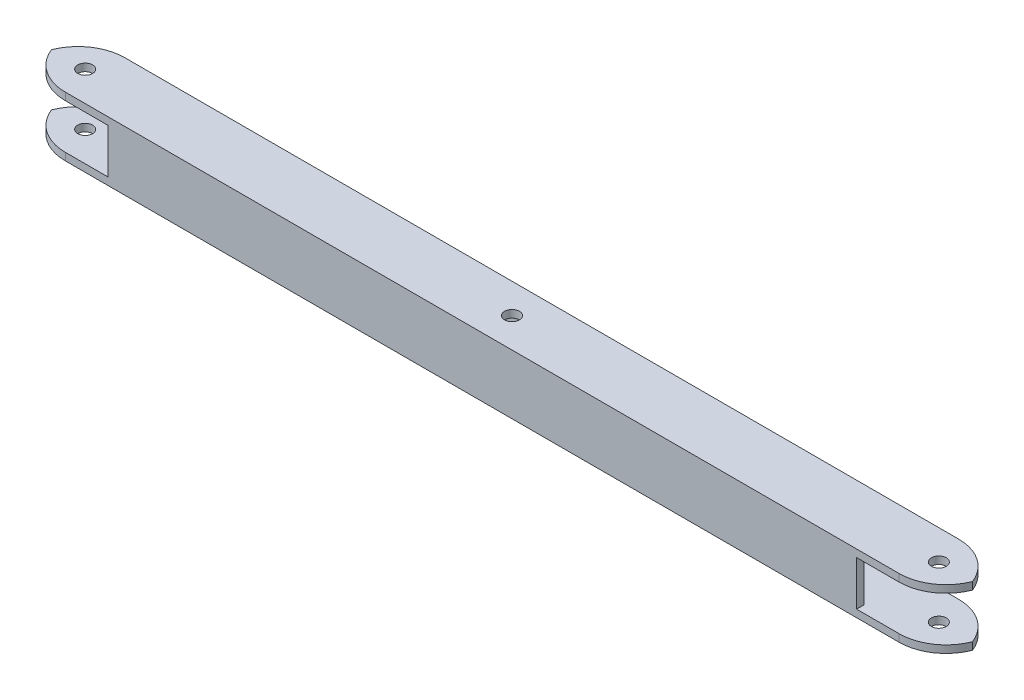
ISO-10303-21;
HEADER;
FILE_DESCRIPTION(('STEP AP214'),'2;1');
FILE_NAME('part.step','',(''),(''),'','','');
FILE_SCHEMA(('AUTOMOTIVE_DESIGN { 1 0 10303 214 1 1 1 1 }'));
ENDSEC;
DATA;
#1=APPLICATION_CONTEXT('core data for automotive mechanical design processes');
#2=APPLICATION_PROTOCOL_DEFINITION('international standard','automotive_design',2000,#1);
#3=PRODUCT_CONTEXT('',#1,'mechanical');
#4=PRODUCT('Part','Part','',(#3));
#5=PRODUCT_RELATED_PRODUCT_CATEGORY('part','',(#4));
#6=PRODUCT_DEFINITION_FORMATION('','',#4);
#7=PRODUCT_DEFINITION_CONTEXT('part definition',#1,'design');
#8=PRODUCT_DEFINITION('design','',#6,#7);
#9=PRODUCT_DEFINITION_SHAPE('','',#8);
#10=(LENGTH_UNIT() NAMED_UNIT(*) SI_UNIT(.MILLI.,.METRE.));
#11=(NAMED_UNIT(*) PLANE_ANGLE_UNIT() SI_UNIT($,.RADIAN.));
#12=(NAMED_UNIT(*) SI_UNIT($,.STERADIAN.) SOLID_ANGLE_UNIT());
#13=UNCERTAINTY_MEASURE_WITH_UNIT(LENGTH_MEASURE(1.E-05),#10,'distance_accuracy_value','');
#14=(GEOMETRIC_REPRESENTATION_CONTEXT(3) GLOBAL_UNCERTAINTY_ASSIGNED_CONTEXT((#13)) GLOBAL_UNIT_ASSIGNED_CONTEXT((#10,
#11,#12)) REPRESENTATION_CONTEXT('',''));
#15=CARTESIAN_POINT('',(0.,0.,0.));
#16=DIRECTION('',(0.,0.,1.));
#17=DIRECTION('',(1.,0.,0.));
#18=AXIS2_PLACEMENT_3D('',#15,#16,#17);
#19=CARTESIAN_POINT('',(395.5,25.4,25.4000000000002));
#20=DIRECTION('',(0.,0.,-1.));
#21=DIRECTION('',(-1.,0.,0.));
#22=AXIS2_PLACEMENT_3D('',#19,#20,#21);
#23=PLANE('',#22);
#24=DIRECTION('',(1.,0.,0.));
#25=VECTOR('',#24,1.);
#26=CARTESIAN_POINT('',(395.5,0.,25.4000000000002));
#27=LINE('',#26,#25);
#28=CARTESIAN_POINT('',(20.,0.,25.4000000000003));
#29=VERTEX_POINT('',#28);
#30=CARTESIAN_POINT('',(375.5,0.,25.4000000000002));
#31=VERTEX_POINT('',#30);
#32=EDGE_CURVE('E284',#29,#31,#27,.T.);
#33=ORIENTED_EDGE('',*,*,#32,.T.);
#34=DIRECTION('',(0.,-1.,0.));
#35=VECTOR('',#34,1.);
#36=CARTESIAN_POINT('',(375.5,25.4,25.4000000000002));
#37=LINE('',#36,#35);
#38=CARTESIAN_POINT('',(375.5,3.175,25.4000000000003));
#39=VERTEX_POINT('',#38);
#40=EDGE_CURVE('E11',#31,#39,#37,.F.);
#41=ORIENTED_EDGE('',*,*,#40,.T.);
#42=DIRECTION('',(1.,0.,0.));
#43=VECTOR('',#42,1.);
#44=CARTESIAN_POINT('',(357.4,3.175,25.4000000000003));
#45=LINE('',#44,#43);
#46=CARTESIAN_POINT('',(357.4,3.175,25.4000000000003));
#47=VERTEX_POINT('',#46);
#48=EDGE_CURVE('E188',#47,#39,#45,.T.);
#49=ORIENTED_EDGE('',*,*,#48,.F.);
#50=DIRECTION('',(0.,1.,0.));
#51=VECTOR('',#50,1.);
#52=CARTESIAN_POINT('',(357.4,22.225,25.4000000000003));
#53=LINE('',#52,#51);
#54=CARTESIAN_POINT('',(357.4,22.225,25.4000000000003));
#55=VERTEX_POINT('',#54);
#56=EDGE_CURVE('E194',#47,#55,#53,.T.);
#57=ORIENTED_EDGE('',*,*,#56,.T.);
#58=DIRECTION('',(1.,0.,0.));
#59=VECTOR('',#58,1.);
#60=CARTESIAN_POINT('',(357.4,22.225,25.4000000000003));
#61=LINE('',#60,#59);
#62=CARTESIAN_POINT('',(375.5,22.225,25.4000000000003));
#63=VERTEX_POINT('',#62);
#64=EDGE_CURVE('E176',#55,#63,#61,.T.);
#65=ORIENTED_EDGE('',*,*,#64,.T.);
#66=DIRECTION('',(0.,-1.,0.));
#67=VECTOR('',#66,1.);
#68=CARTESIAN_POINT('',(375.5,25.4,25.4000000000002));
#69=LINE('',#68,#67);
#70=CARTESIAN_POINT('',(375.5,25.4,25.4000000000002));
#71=VERTEX_POINT('',#70);
#72=EDGE_CURVE('E46',#63,#71,#69,.F.);
#73=ORIENTED_EDGE('',*,*,#72,.T.);
#74=DIRECTION('',(1.,0.,0.));
#75=VECTOR('',#74,1.);
#76=CARTESIAN_POINT('',(395.5,25.4,25.4000000000002));
#77=LINE('',#76,#75);
#78=CARTESIAN_POINT('',(20.,25.4,25.4000000000003));
#79=VERTEX_POINT('',#78);
#80=EDGE_CURVE('E287',#79,#71,#77,.T.);
#81=ORIENTED_EDGE('',*,*,#80,.F.);
#82=DIRECTION('',(0.,-1.,0.));
#83=VECTOR('',#82,1.);
#84=CARTESIAN_POINT('',(20.,25.4,25.4000000000003));
#85=LINE('',#84,#83);
#86=CARTESIAN_POINT('',(20.,22.225,25.4000000000003));
#87=VERTEX_POINT('',#86);
#88=EDGE_CURVE('E344',#79,#87,#85,.T.);
#89=ORIENTED_EDGE('',*,*,#88,.T.);
#90=DIRECTION('',(-1.,0.,0.));
#91=VECTOR('',#90,1.);
#92=CARTESIAN_POINT('',(38.1,22.225,25.4000000000003));
#93=LINE('',#92,#91);
#94=CARTESIAN_POINT('',(38.1,22.225,25.4000000000003));
#95=VERTEX_POINT('',#94);
#96=EDGE_CURVE('E232',#95,#87,#93,.T.);
#97=ORIENTED_EDGE('',*,*,#96,.F.);
#98=DIRECTION('',(0.,1.,0.));
#99=VECTOR('',#98,1.);
#100=CARTESIAN_POINT('',(38.1,22.225,25.4000000000003));
#101=LINE('',#100,#99);
#102=CARTESIAN_POINT('',(38.1,3.175,25.4000000000003));
#103=VERTEX_POINT('',#102);
#104=EDGE_CURVE('E228',#103,#95,#101,.T.);
#105=ORIENTED_EDGE('',*,*,#104,.F.);
#106=DIRECTION('',(-1.,0.,0.));
#107=VECTOR('',#106,1.);
#108=CARTESIAN_POINT('',(38.1,3.175,25.4000000000003));
#109=LINE('',#108,#107);
#110=CARTESIAN_POINT('',(20.,3.175,25.4000000000003));
#111=VERTEX_POINT('',#110);
#112=EDGE_CURVE('E236',#103,#111,#109,.T.);
#113=ORIENTED_EDGE('',*,*,#112,.T.);
#114=DIRECTION('',(0.,-1.,0.));
#115=VECTOR('',#114,1.);
#116=CARTESIAN_POINT('',(20.,25.4,25.4000000000003));
#117=LINE('',#116,#115);
#118=EDGE_CURVE('E347',#111,#29,#117,.T.);
#119=ORIENTED_EDGE('',*,*,#118,.T.);
#120=EDGE_LOOP('',(#33,#41,#49,#57,#65,#73,#81,#89,#97,#105,#113,#119));
#121=FACE_BOUND('',#120,.T.);
#122=ADVANCED_FACE('F37',(#121),#23,.F.);
#123=CARTESIAN_POINT('',(0.,25.4,0.));
#124=DIRECTION('',(0.,0.,1.));
#125=DIRECTION('',(1.,0.,0.));
#126=AXIS2_PLACEMENT_3D('',#123,#124,#125);
#127=PLANE('',#126);
#128=DIRECTION('',(1.,0.,0.));
#129=VECTOR('',#128,1.);
#130=CARTESIAN_POINT('',(357.4,3.175,0.));
#131=LINE('',#130,#129);
#132=CARTESIAN_POINT('',(357.4,3.175,0.));
#133=VERTEX_POINT('',#132);
#134=CARTESIAN_POINT('',(375.5,3.175,0.));
#135=VERTEX_POINT('',#134);
#136=EDGE_CURVE('E212',#133,#135,#131,.T.);
#137=ORIENTED_EDGE('',*,*,#136,.T.);
#138=DIRECTION('',(0.,-1.,0.));
#139=VECTOR('',#138,1.);
#140=CARTESIAN_POINT('',(375.5,25.4,0.));
#141=LINE('',#140,#139);
#142=CARTESIAN_POINT('',(375.5,0.,0.));
#143=VERTEX_POINT('',#142);
#144=EDGE_CURVE('E312',#135,#143,#141,.T.);
#145=ORIENTED_EDGE('',*,*,#144,.T.);
#146=DIRECTION('',(-1.,0.,0.));
#147=VECTOR('',#146,1.);
#148=CARTESIAN_POINT('',(0.,0.,0.));
#149=LINE('',#148,#147);
#150=CARTESIAN_POINT('',(20.,0.,0.));
#151=VERTEX_POINT('',#150);
#152=EDGE_CURVE('E290',#143,#151,#149,.T.);
#153=ORIENTED_EDGE('',*,*,#152,.T.);
#154=DIRECTION('',(0.,-1.,0.));
#155=VECTOR('',#154,1.);
#156=CARTESIAN_POINT('',(20.,25.4,0.));
#157=LINE('',#156,#155);
#158=CARTESIAN_POINT('',(20.,3.175,0.));
#159=VERTEX_POINT('',#158);
#160=EDGE_CURVE('E307',#151,#159,#157,.F.);
#161=ORIENTED_EDGE('',*,*,#160,.T.);
#162=DIRECTION('',(-1.,0.,0.));
#163=VECTOR('',#162,1.);
#164=CARTESIAN_POINT('',(38.1,3.175,0.));
#165=LINE('',#164,#163);
#166=CARTESIAN_POINT('',(38.1,3.175,0.));
#167=VERTEX_POINT('',#166);
#168=EDGE_CURVE('E239',#167,#159,#165,.T.);
#169=ORIENTED_EDGE('',*,*,#168,.F.);
#170=DIRECTION('',(0.,-1.,0.));
#171=VECTOR('',#170,1.);
#172=CARTESIAN_POINT('',(38.1,3.175,0.));
#173=LINE('',#172,#171);
#174=CARTESIAN_POINT('',(38.1,22.225,0.));
#175=VERTEX_POINT('',#174);
#176=EDGE_CURVE('E221',#175,#167,#173,.T.);
#177=ORIENTED_EDGE('',*,*,#176,.F.);
#178=DIRECTION('',(-1.,0.,0.));
#179=VECTOR('',#178,1.);
#180=CARTESIAN_POINT('',(38.1,22.225,0.));
#181=LINE('',#180,#179);
#182=CARTESIAN_POINT('',(20.,22.225,0.));
#183=VERTEX_POINT('',#182);
#184=EDGE_CURVE('E231',#175,#183,#181,.T.);
#185=ORIENTED_EDGE('',*,*,#184,.T.);
#186=DIRECTION('',(0.,-1.,0.));
#187=VECTOR('',#186,1.);
#188=CARTESIAN_POINT('',(20.,25.4,0.));
#189=LINE('',#188,#187);
#190=CARTESIAN_POINT('',(20.,25.4,0.));
#191=VERTEX_POINT('',#190);
#192=EDGE_CURVE('E305',#183,#191,#189,.F.);
#193=ORIENTED_EDGE('',*,*,#192,.T.);
#194=DIRECTION('',(-1.,0.,0.));
#195=VECTOR('',#194,1.);
#196=CARTESIAN_POINT('',(0.,25.4,0.));
#197=LINE('',#196,#195);
#198=CARTESIAN_POINT('',(375.5,25.4,0.));
#199=VERTEX_POINT('',#198);
#200=EDGE_CURVE('E289',#199,#191,#197,.T.);
#201=ORIENTED_EDGE('',*,*,#200,.F.);
#202=DIRECTION('',(0.,-1.,0.));
#203=VECTOR('',#202,1.);
#204=CARTESIAN_POINT('',(375.5,25.4,0.));
#205=LINE('',#204,#203);
#206=CARTESIAN_POINT('',(375.5,22.225,0.));
#207=VERTEX_POINT('',#206);
#208=EDGE_CURVE('E309',#199,#207,#205,.T.);
#209=ORIENTED_EDGE('',*,*,#208,.T.);
#210=DIRECTION('',(1.,0.,0.));
#211=VECTOR('',#210,1.);
#212=CARTESIAN_POINT('',(357.4,22.225,0.));
#213=LINE('',#212,#211);
#214=CARTESIAN_POINT('',(357.4,22.225,0.));
#215=VERTEX_POINT('',#214);
#216=EDGE_CURVE('E210',#215,#207,#213,.T.);
#217=ORIENTED_EDGE('',*,*,#216,.F.);
#218=DIRECTION('',(0.,-1.,0.));
#219=VECTOR('',#218,1.);
#220=CARTESIAN_POINT('',(357.4,3.175,0.));
#221=LINE('',#220,#219);
#222=EDGE_CURVE('E189',#215,#133,#221,.T.);
#223=ORIENTED_EDGE('',*,*,#222,.T.);
#224=EDGE_LOOP('',(#137,#145,#153,#161,#169,#177,#185,#193,#201,#209,#217,#223));
#225=FACE_BOUND('',#224,.T.);
#226=ADVANCED_FACE('F373',(#225),#127,.F.);
#227=CARTESIAN_POINT('',(197.75,25.4,12.7));
#228=DIRECTION('',(0.,-1.,0.));
#229=DIRECTION('',(0.,0.,-1.));
#230=AXIS2_PLACEMENT_3D('',#227,#228,#229);
#231=CYLINDRICAL_SURFACE('',#230,3.175);
#232=CARTESIAN_POINT('',(197.75,22.225,12.7));
#233=DIRECTION('',(0.,1.,0.));
#234=DIRECTION('',(0.,0.,1.));
#235=AXIS2_PLACEMENT_3D('',#232,#233,#234);
#236=CIRCLE('',#235,3.175);
#237=CARTESIAN_POINT('',(197.75,22.225,15.875));
#238=VERTEX_POINT('',#237);
#239=EDGE_CURVE('E265',#238,#238,#236,.T.);
#240=ORIENTED_EDGE('',*,*,#239,.F.);
#241=EDGE_LOOP('',(#240));
#242=FACE_BOUND('',#241,.T.);
#243=CARTESIAN_POINT('',(197.75,25.4,12.7));
#244=DIRECTION('',(0.,1.,0.));
#245=DIRECTION('',(0.,0.,1.));
#246=AXIS2_PLACEMENT_3D('',#243,#244,#245);
#247=CIRCLE('',#246,3.175);
#248=CARTESIAN_POINT('',(197.75,25.4,15.875));
#249=VERTEX_POINT('',#248);
#250=EDGE_CURVE('E281',#249,#249,#247,.T.);
#251=ORIENTED_EDGE('',*,*,#250,.T.);
#252=EDGE_LOOP('',(#251));
#253=FACE_BOUND('',#252,.T.);
#254=ADVANCED_FACE('F442',(#242,#253),#231,.F.);
#255=CARTESIAN_POINT('',(379.74,25.4,12.7));
#256=DIRECTION('',(0.,-1.,0.));
#257=DIRECTION('',(0.,0.,-1.));
#258=AXIS2_PLACEMENT_3D('',#255,#256,#257);
#259=CYLINDRICAL_SURFACE('',#258,3.17500000000009);
#260=CARTESIAN_POINT('',(379.74,22.225,12.7));
#261=DIRECTION('',(0.,1.,0.));
#262=DIRECTION('',(0.,0.,1.));
#263=AXIS2_PLACEMENT_3D('',#260,#261,#262);
#264=CIRCLE('',#263,3.17500000000009);
#265=CARTESIAN_POINT('',(379.74,22.225,15.8750000000001));
#266=VERTEX_POINT('',#265);
#267=EDGE_CURVE('E262',#266,#266,#264,.T.);
#268=ORIENTED_EDGE('',*,*,#267,.F.);
#269=EDGE_LOOP('',(#268));
#270=FACE_BOUND('',#269,.T.);
#271=CARTESIAN_POINT('',(379.74,25.4,12.7));
#272=DIRECTION('',(0.,1.,0.));
#273=DIRECTION('',(0.,0.,-1.));
#274=AXIS2_PLACEMENT_3D('',#271,#272,#273);
#275=CIRCLE('',#274,3.17500000000009);
#276=CARTESIAN_POINT('',(379.74,25.4,9.52499999999993));
#277=VERTEX_POINT('',#276);
#278=EDGE_CURVE('E275',#277,#277,#275,.T.);
#279=ORIENTED_EDGE('',*,*,#278,.T.);
#280=EDGE_LOOP('',(#279));
#281=FACE_BOUND('',#280,.T.);
#282=ADVANCED_FACE('F478',(#270,#281),#259,.F.);
#283=CARTESIAN_POINT('',(15.76,25.4,12.7000000000001));
#284=DIRECTION('',(0.,-1.,0.));
#285=DIRECTION('',(0.,0.,-1.));
#286=AXIS2_PLACEMENT_3D('',#283,#284,#285);
#287=CYLINDRICAL_SURFACE('',#286,3.17500000000001);
#288=CARTESIAN_POINT('',(15.76,22.225,12.7000000000001));
#289=DIRECTION('',(0.,1.,0.));
#290=DIRECTION('',(0.,0.,1.));
#291=AXIS2_PLACEMENT_3D('',#288,#289,#290);
#292=CIRCLE('',#291,3.17500000000001);
#293=CARTESIAN_POINT('',(15.76,22.225,15.8750000000001));
#294=VERTEX_POINT('',#293);
#295=EDGE_CURVE('E261',#294,#294,#292,.T.);
#296=ORIENTED_EDGE('',*,*,#295,.F.);
#297=EDGE_LOOP('',(#296));
#298=FACE_BOUND('',#297,.T.);
#299=CARTESIAN_POINT('',(15.76,25.4,12.7000000000001));
#300=DIRECTION('',(0.,1.,0.));
#301=DIRECTION('',(0.,0.,1.));
#302=AXIS2_PLACEMENT_3D('',#299,#300,#301);
#303=CIRCLE('',#302,3.17500000000001);
#304=CARTESIAN_POINT('',(15.76,25.4,15.8750000000001));
#305=VERTEX_POINT('',#304);
#306=EDGE_CURVE('E269',#305,#305,#303,.T.);
#307=ORIENTED_EDGE('',*,*,#306,.T.);
#308=EDGE_LOOP('',(#307));
#309=FACE_BOUND('',#308,.T.);
#310=ADVANCED_FACE('F473',(#298,#309),#287,.F.);
#311=CARTESIAN_POINT('',(0.,25.4,0.));
#312=DIRECTION('',(0.,-1.,0.));
#313=DIRECTION('',(0.,0.,-1.));
#314=AXIS2_PLACEMENT_3D('',#311,#312,#313);
#315=PLANE('',#314);
#316=CARTESIAN_POINT('',(375.5,25.4,5.40000000000018));
#317=DIRECTION('',(0.,-1.,0.));
#318=DIRECTION('',(0.,0.,-1.));
#319=AXIS2_PLACEMENT_3D('',#316,#317,#318);
#320=CIRCLE('',#319,20.);
#321=CARTESIAN_POINT('',(394.120150375333,25.4,12.7000000000001));
#322=VERTEX_POINT('',#321);
#323=EDGE_CURVE('E54',#71,#322,#320,.F.);
#324=ORIENTED_EDGE('',*,*,#323,.T.);
#325=CARTESIAN_POINT('',(375.5,25.4,20.));
#326=DIRECTION('',(0.,-1.,0.));
#327=DIRECTION('',(0.,0.,-1.));
#328=AXIS2_PLACEMENT_3D('',#325,#326,#327);
#329=CIRCLE('',#328,20.);
#330=EDGE_CURVE('E342',#322,#199,#329,.F.);
#331=ORIENTED_EDGE('',*,*,#330,.T.);
#332=ORIENTED_EDGE('',*,*,#200,.T.);
#333=CARTESIAN_POINT('',(20.,25.4,20.));
#334=DIRECTION('',(0.,-1.,0.));
#335=DIRECTION('',(0.,0.,-1.));
#336=AXIS2_PLACEMENT_3D('',#333,#334,#335);
#337=CIRCLE('',#336,20.);
#338=CARTESIAN_POINT('',(1.37984962466732,25.4,12.7000000000001));
#339=VERTEX_POINT('',#338);
#340=EDGE_CURVE('E61',#191,#339,#337,.F.);
#341=ORIENTED_EDGE('',*,*,#340,.T.);
#342=CARTESIAN_POINT('',(20.,25.4,5.40000000000028));
#343=DIRECTION('',(0.,-1.,0.));
#344=DIRECTION('',(0.,0.,-1.));
#345=AXIS2_PLACEMENT_3D('',#342,#343,#344);
#346=CIRCLE('',#345,20.);
#347=EDGE_CURVE('E339',#339,#79,#346,.F.);
#348=ORIENTED_EDGE('',*,*,#347,.T.);
#349=ORIENTED_EDGE('',*,*,#80,.T.);
#350=EDGE_LOOP('',(#324,#331,#332,#341,#348,#349));
#351=FACE_BOUND('',#350,.T.);
#352=ORIENTED_EDGE('',*,*,#250,.F.);
#353=EDGE_LOOP('',(#352));
#354=FACE_BOUND('',#353,.T.);
#355=ORIENTED_EDGE('',*,*,#278,.F.);
#356=EDGE_LOOP('',(#355));
#357=FACE_BOUND('',#356,.T.);
#358=ORIENTED_EDGE('',*,*,#306,.F.);
#359=EDGE_LOOP('',(#358));
#360=FACE_BOUND('',#359,.T.);
#361=ADVANCED_FACE('F417',(#351,#354,#357,#360),#315,.F.);
#362=CARTESIAN_POINT('',(0.,0.,0.));
#363=DIRECTION('',(0.,-1.,0.));
#364=DIRECTION('',(0.,0.,-1.));
#365=AXIS2_PLACEMENT_3D('',#362,#363,#364);
#366=PLANE('',#365);
#367=CARTESIAN_POINT('',(379.74,0.,12.7));
#368=DIRECTION('',(0.,1.,0.));
#369=DIRECTION('',(0.,0.,-1.));
#370=AXIS2_PLACEMENT_3D('',#367,#368,#369);
#371=CIRCLE('',#370,3.17500000000009);
#372=CARTESIAN_POINT('',(379.74,0.,9.52499999999993));
#373=VERTEX_POINT('',#372);
#374=EDGE_CURVE('E272',#373,#373,#371,.T.);
#375=ORIENTED_EDGE('',*,*,#374,.T.);
#376=EDGE_LOOP('',(#375));
#377=FACE_BOUND('',#376,.T.);
#378=ORIENTED_EDGE('',*,*,#152,.F.);
#379=CARTESIAN_POINT('',(375.5,0.,20.));
#380=DIRECTION('',(0.,-1.,0.));
#381=DIRECTION('',(0.,0.,-1.));
#382=AXIS2_PLACEMENT_3D('',#379,#380,#381);
#383=CIRCLE('',#382,20.);
#384=CARTESIAN_POINT('',(394.120150375333,0.,12.7000000000001));
#385=VERTEX_POINT('',#384);
#386=EDGE_CURVE('E321',#143,#385,#383,.T.);
#387=ORIENTED_EDGE('',*,*,#386,.T.);
#388=CARTESIAN_POINT('',(375.5,0.,5.40000000000018));
#389=DIRECTION('',(0.,-1.,0.));
#390=DIRECTION('',(0.,0.,-1.));
#391=AXIS2_PLACEMENT_3D('',#388,#389,#390);
#392=CIRCLE('',#391,20.);
#393=EDGE_CURVE('E319',#385,#31,#392,.T.);
#394=ORIENTED_EDGE('',*,*,#393,.T.);
#395=ORIENTED_EDGE('',*,*,#32,.F.);
#396=CARTESIAN_POINT('',(20.,0.,5.40000000000028));
#397=DIRECTION('',(0.,-1.,0.));
#398=DIRECTION('',(0.,0.,-1.));
#399=AXIS2_PLACEMENT_3D('',#396,#397,#398);
#400=CIRCLE('',#399,20.);
#401=CARTESIAN_POINT('',(1.37984962466732,0.,12.7000000000001));
#402=VERTEX_POINT('',#401);
#403=EDGE_CURVE('E317',#29,#402,#400,.T.);
#404=ORIENTED_EDGE('',*,*,#403,.T.);
#405=CARTESIAN_POINT('',(20.,0.,20.));
#406=DIRECTION('',(0.,-1.,0.));
#407=DIRECTION('',(0.,0.,-1.));
#408=AXIS2_PLACEMENT_3D('',#405,#406,#407);
#409=CIRCLE('',#408,20.);
#410=EDGE_CURVE('E315',#402,#151,#409,.T.);
#411=ORIENTED_EDGE('',*,*,#410,.T.);
#412=EDGE_LOOP('',(#378,#387,#394,#395,#404,#411));
#413=FACE_BOUND('',#412,.T.);
#414=CARTESIAN_POINT('',(197.75,0.,12.7));
#415=DIRECTION('',(0.,1.,0.));
#416=DIRECTION('',(0.,0.,1.));
#417=AXIS2_PLACEMENT_3D('',#414,#415,#416);
#418=CIRCLE('',#417,3.175);
#419=CARTESIAN_POINT('',(197.75,0.,15.875));
#420=VERTEX_POINT('',#419);
#421=EDGE_CURVE('E278',#420,#420,#418,.T.);
#422=ORIENTED_EDGE('',*,*,#421,.T.);
#423=EDGE_LOOP('',(#422));
#424=FACE_BOUND('',#423,.T.);
#425=CARTESIAN_POINT('',(15.76,0.,12.7000000000001));
#426=DIRECTION('',(0.,1.,0.));
#427=DIRECTION('',(0.,0.,1.));
#428=AXIS2_PLACEMENT_3D('',#425,#426,#427);
#429=CIRCLE('',#428,3.17500000000001);
#430=CARTESIAN_POINT('',(15.76,0.,15.8750000000001));
#431=VERTEX_POINT('',#430);
#432=EDGE_CURVE('E268',#431,#431,#429,.T.);
#433=ORIENTED_EDGE('',*,*,#432,.T.);
#434=EDGE_LOOP('',(#433));
#435=FACE_BOUND('',#434,.T.);
#436=ADVANCED_FACE('F399',(#377,#413,#424,#435),#366,.T.);
#437=CARTESIAN_POINT('',(197.75,3.175,12.7));
#438=DIRECTION('',(0.,-1.,0.));
#439=DIRECTION('',(0.,0.,-1.));
#440=AXIS2_PLACEMENT_3D('',#437,#438,#439);
#441=CIRCLE('',#440,3.175);
#442=CARTESIAN_POINT('',(197.75,3.175,9.52500000000001));
#443=VERTEX_POINT('',#442);
#444=EDGE_CURVE('E258',#443,#443,#441,.T.);
#445=ORIENTED_EDGE('',*,*,#444,.F.);
#446=EDGE_LOOP('',(#445));
#447=FACE_BOUND('',#446,.T.);
#448=ORIENTED_EDGE('',*,*,#421,.F.);
#449=EDGE_LOOP('',(#448));
#450=FACE_BOUND('',#449,.T.);
#451=ADVANCED_FACE('F476',(#447,#450),#231,.F.);
#452=CARTESIAN_POINT('',(379.74,3.175,12.7));
#453=DIRECTION('',(0.,-1.,0.));
#454=DIRECTION('',(0.,0.,-1.));
#455=AXIS2_PLACEMENT_3D('',#452,#453,#454);
#456=CIRCLE('',#455,3.17500000000009);
#457=CARTESIAN_POINT('',(379.74,3.175,9.52499999999993));
#458=VERTEX_POINT('',#457);
#459=EDGE_CURVE('E255',#458,#458,#456,.T.);
#460=ORIENTED_EDGE('',*,*,#459,.F.);
#461=EDGE_LOOP('',(#460));
#462=FACE_BOUND('',#461,.T.);
#463=ORIENTED_EDGE('',*,*,#374,.F.);
#464=EDGE_LOOP('',(#463));
#465=FACE_BOUND('',#464,.T.);
#466=ADVANCED_FACE('F471',(#462,#465),#259,.F.);
#467=CARTESIAN_POINT('',(15.76,3.175,12.7000000000001));
#468=DIRECTION('',(0.,-1.,0.));
#469=DIRECTION('',(0.,0.,-1.));
#470=AXIS2_PLACEMENT_3D('',#467,#468,#469);
#471=CIRCLE('',#470,3.17500000000001);
#472=CARTESIAN_POINT('',(15.76,3.175,9.52500000000005));
#473=VERTEX_POINT('',#472);
#474=EDGE_CURVE('E249',#473,#473,#471,.T.);
#475=ORIENTED_EDGE('',*,*,#474,.F.);
#476=EDGE_LOOP('',(#475));
#477=FACE_BOUND('',#476,.T.);
#478=ORIENTED_EDGE('',*,*,#432,.F.);
#479=EDGE_LOOP('',(#478));
#480=FACE_BOUND('',#479,.T.);
#481=ADVANCED_FACE('F467',(#477,#480),#287,.F.);
#482=CARTESIAN_POINT('',(422.440768363208,22.225,22.2250000000003));
#483=DIRECTION('',(0.,1.,0.));
#484=DIRECTION('',(0.,0.,1.));
#485=AXIS2_PLACEMENT_3D('',#482,#483,#484);
#486=PLANE('',#485);
#487=ORIENTED_EDGE('',*,*,#239,.T.);
#488=EDGE_LOOP('',(#487));
#489=FACE_BOUND('',#488,.T.);
#490=ORIENTED_EDGE('',*,*,#216,.T.);
#491=CARTESIAN_POINT('',(375.5,22.225,20.));
#492=DIRECTION('',(0.,1.,0.));
#493=DIRECTION('',(0.,0.,1.));
#494=AXIS2_PLACEMENT_3D('',#491,#492,#493);
#495=CIRCLE('',#494,20.);
#496=CARTESIAN_POINT('',(394.120150375333,22.225,12.7000000000001));
#497=VERTEX_POINT('',#496);
#498=EDGE_CURVE('E336',#207,#497,#495,.F.);
#499=ORIENTED_EDGE('',*,*,#498,.T.);
#500=CARTESIAN_POINT('',(375.5,22.225,5.40000000000018));
#501=DIRECTION('',(0.,1.,0.));
#502=DIRECTION('',(0.,0.,1.));
#503=AXIS2_PLACEMENT_3D('',#500,#501,#502);
#504=CIRCLE('',#503,20.);
#505=EDGE_CURVE('E184',#497,#63,#504,.F.);
#506=ORIENTED_EDGE('',*,*,#505,.T.);
#507=ORIENTED_EDGE('',*,*,#64,.F.);
#508=DIRECTION('',(0.,0.,-1.));
#509=VECTOR('',#508,1.);
#510=CARTESIAN_POINT('',(357.4,22.225,0.));
#511=LINE('',#510,#509);
#512=CARTESIAN_POINT('',(357.4,22.225,22.2250000000003));
#513=VERTEX_POINT('',#512);
#514=EDGE_CURVE('E181',#55,#513,#511,.T.);
#515=ORIENTED_EDGE('',*,*,#514,.T.);
#516=DIRECTION('',(-1.,0.,0.));
#517=VECTOR('',#516,1.);
#518=CARTESIAN_POINT('',(422.440768363208,22.225,22.2250000000003));
#519=LINE('',#518,#517);
#520=CARTESIAN_POINT('',(38.1,22.225,22.2250000000003));
#521=VERTEX_POINT('',#520);
#522=EDGE_CURVE('E247',#513,#521,#519,.T.);
#523=ORIENTED_EDGE('',*,*,#522,.T.);
#524=DIRECTION('',(0.,0.,-1.));
#525=VECTOR('',#524,1.);
#526=CARTESIAN_POINT('',(38.1,22.225,0.));
#527=LINE('',#526,#525);
#528=EDGE_CURVE('E218',#95,#521,#527,.T.);
#529=ORIENTED_EDGE('',*,*,#528,.F.);
#530=ORIENTED_EDGE('',*,*,#96,.T.);
#531=CARTESIAN_POINT('',(20.,22.225,5.40000000000028));
#532=DIRECTION('',(0.,1.,0.));
#533=DIRECTION('',(0.,0.,1.));
#534=AXIS2_PLACEMENT_3D('',#531,#532,#533);
#535=CIRCLE('',#534,20.);
#536=CARTESIAN_POINT('',(1.37984962466732,22.225,12.7000000000001));
#537=VERTEX_POINT('',#536);
#538=EDGE_CURVE('E333',#87,#537,#535,.F.);
#539=ORIENTED_EDGE('',*,*,#538,.T.);
#540=CARTESIAN_POINT('',(20.,22.225,20.));
#541=DIRECTION('',(0.,1.,0.));
#542=DIRECTION('',(0.,0.,1.));
#543=AXIS2_PLACEMENT_3D('',#540,#541,#542);
#544=CIRCLE('',#543,20.);
#545=EDGE_CURVE('E331',#537,#183,#544,.F.);
#546=ORIENTED_EDGE('',*,*,#545,.T.);
#547=ORIENTED_EDGE('',*,*,#184,.F.);
#548=CARTESIAN_POINT('',(38.1,22.225,3.175));
#549=VERTEX_POINT('',#548);
#550=EDGE_CURVE('E217',#549,#175,#527,.T.);
#551=ORIENTED_EDGE('',*,*,#550,.F.);
#552=DIRECTION('',(-1.,0.,0.));
#553=VECTOR('',#552,1.);
#554=CARTESIAN_POINT('',(422.440768363208,22.225,3.175));
#555=LINE('',#554,#553);
#556=CARTESIAN_POINT('',(357.4,22.225,3.175));
#557=VERTEX_POINT('',#556);
#558=EDGE_CURVE('E246',#557,#549,#555,.T.);
#559=ORIENTED_EDGE('',*,*,#558,.F.);
#560=EDGE_CURVE('E198',#557,#215,#511,.T.);
#561=ORIENTED_EDGE('',*,*,#560,.T.);
#562=EDGE_LOOP('',(#490,#499,#506,#507,#515,#523,#529,#530,#539,#546,#547,#551,#559,#561));
#563=FACE_BOUND('',#562,.T.);
#564=ORIENTED_EDGE('',*,*,#295,.T.);
#565=EDGE_LOOP('',(#564));
#566=FACE_BOUND('',#565,.T.);
#567=ORIENTED_EDGE('',*,*,#267,.T.);
#568=EDGE_LOOP('',(#567));
#569=FACE_BOUND('',#568,.T.);
#570=ADVANCED_FACE('F179',(#489,#563,#566,#569),#486,.F.);
#571=CARTESIAN_POINT('',(422.440768363208,3.175,22.2250000000003));
#572=DIRECTION('',(0.,0.,1.));
#573=DIRECTION('',(1.,0.,0.));
#574=AXIS2_PLACEMENT_3D('',#571,#572,#573);
#575=PLANE('',#574);
#576=ORIENTED_EDGE('',*,*,#522,.F.);
#577=DIRECTION('',(0.,-1.,0.));
#578=VECTOR('',#577,1.);
#579=CARTESIAN_POINT('',(357.4,3.175,22.2250000000003));
#580=LINE('',#579,#578);
#581=CARTESIAN_POINT('',(357.4,3.175,22.2250000000003));
#582=VERTEX_POINT('',#581);
#583=EDGE_CURVE('E197',#513,#582,#580,.T.);
#584=ORIENTED_EDGE('',*,*,#583,.T.);
#585=DIRECTION('',(-1.,0.,0.));
#586=VECTOR('',#585,1.);
#587=CARTESIAN_POINT('',(422.440768363208,3.175,22.2250000000003));
#588=LINE('',#587,#586);
#589=CARTESIAN_POINT('',(38.1,3.175,22.2250000000003));
#590=VERTEX_POINT('',#589);
#591=EDGE_CURVE('E250',#582,#590,#588,.T.);
#592=ORIENTED_EDGE('',*,*,#591,.T.);
#593=DIRECTION('',(0.,1.,0.));
#594=VECTOR('',#593,1.);
#595=CARTESIAN_POINT('',(38.1,3.175,22.2250000000003));
#596=LINE('',#595,#594);
#597=EDGE_CURVE('E235',#590,#521,#596,.T.);
#598=ORIENTED_EDGE('',*,*,#597,.T.);
#599=EDGE_LOOP('',(#576,#584,#592,#598));
#600=FACE_BOUND('',#599,.T.);
#601=ADVANCED_FACE('F409',(#600),#575,.F.);
#602=CARTESIAN_POINT('',(422.440768363208,3.175,3.175));
#603=DIRECTION('',(0.,-1.,0.));
#604=DIRECTION('',(0.,0.,-1.));
#605=AXIS2_PLACEMENT_3D('',#602,#603,#604);
#606=PLANE('',#605);
#607=ORIENTED_EDGE('',*,*,#444,.T.);
#608=EDGE_LOOP('',(#607));
#609=FACE_BOUND('',#608,.T.);
#610=CARTESIAN_POINT('',(375.5,3.175,5.40000000000018));
#611=DIRECTION('',(0.,-1.,0.));
#612=DIRECTION('',(0.,0.,-1.));
#613=AXIS2_PLACEMENT_3D('',#610,#611,#612);
#614=CIRCLE('',#613,20.);
#615=CARTESIAN_POINT('',(394.120150375333,3.175,12.7000000000001));
#616=VERTEX_POINT('',#615);
#617=EDGE_CURVE('E327',#39,#616,#614,.F.);
#618=ORIENTED_EDGE('',*,*,#617,.T.);
#619=CARTESIAN_POINT('',(375.5,3.175,20.));
#620=DIRECTION('',(0.,-1.,0.));
#621=DIRECTION('',(0.,0.,-1.));
#622=AXIS2_PLACEMENT_3D('',#619,#620,#621);
#623=CIRCLE('',#622,20.);
#624=EDGE_CURVE('E329',#616,#135,#623,.F.);
#625=ORIENTED_EDGE('',*,*,#624,.T.);
#626=ORIENTED_EDGE('',*,*,#136,.F.);
#627=DIRECTION('',(0.,0.,1.));
#628=VECTOR('',#627,1.);
#629=CARTESIAN_POINT('',(357.4,3.175,25.4000000000003));
#630=LINE('',#629,#628);
#631=CARTESIAN_POINT('',(357.4,3.175,3.175));
#632=VERTEX_POINT('',#631);
#633=EDGE_CURVE('E204',#133,#632,#630,.T.);
#634=ORIENTED_EDGE('',*,*,#633,.T.);
#635=DIRECTION('',(-1.,0.,0.));
#636=VECTOR('',#635,1.);
#637=CARTESIAN_POINT('',(422.440768363208,3.175,3.175));
#638=LINE('',#637,#636);
#639=CARTESIAN_POINT('',(38.1,3.175,3.175));
#640=VERTEX_POINT('',#639);
#641=EDGE_CURVE('E252',#632,#640,#638,.T.);
#642=ORIENTED_EDGE('',*,*,#641,.T.);
#643=DIRECTION('',(0.,0.,1.));
#644=VECTOR('',#643,1.);
#645=CARTESIAN_POINT('',(38.1,3.175,25.4000000000003));
#646=LINE('',#645,#644);
#647=EDGE_CURVE('E225',#167,#640,#646,.T.);
#648=ORIENTED_EDGE('',*,*,#647,.F.);
#649=ORIENTED_EDGE('',*,*,#168,.T.);
#650=CARTESIAN_POINT('',(20.,3.175,20.));
#651=DIRECTION('',(0.,-1.,0.));
#652=DIRECTION('',(0.,0.,-1.));
#653=AXIS2_PLACEMENT_3D('',#650,#651,#652);
#654=CIRCLE('',#653,20.);
#655=CARTESIAN_POINT('',(1.37984962466732,3.175,12.7000000000001));
#656=VERTEX_POINT('',#655);
#657=EDGE_CURVE('E323',#159,#656,#654,.F.);
#658=ORIENTED_EDGE('',*,*,#657,.T.);
#659=CARTESIAN_POINT('',(20.,3.175,5.40000000000028));
#660=DIRECTION('',(0.,-1.,0.));
#661=DIRECTION('',(0.,0.,-1.));
#662=AXIS2_PLACEMENT_3D('',#659,#660,#661);
#663=CIRCLE('',#662,20.);
#664=EDGE_CURVE('E325',#656,#111,#663,.F.);
#665=ORIENTED_EDGE('',*,*,#664,.T.);
#666=ORIENTED_EDGE('',*,*,#112,.F.);
#667=EDGE_CURVE('E224',#590,#103,#646,.T.);
#668=ORIENTED_EDGE('',*,*,#667,.F.);
#669=ORIENTED_EDGE('',*,*,#591,.F.);
#670=EDGE_CURVE('E202',#582,#47,#630,.T.);
#671=ORIENTED_EDGE('',*,*,#670,.T.);
#672=ORIENTED_EDGE('',*,*,#48,.T.);
#673=EDGE_LOOP('',(#618,#625,#626,#634,#642,#648,#649,#658,#665,#666,#668,#669,#671,#672));
#674=FACE_BOUND('',#673,.T.);
#675=ORIENTED_EDGE('',*,*,#474,.T.);
#676=EDGE_LOOP('',(#675));
#677=FACE_BOUND('',#676,.T.);
#678=ORIENTED_EDGE('',*,*,#459,.T.);
#679=EDGE_LOOP('',(#678));
#680=FACE_BOUND('',#679,.T.);
#681=ADVANCED_FACE('F388',(#609,#674,#677,#680),#606,.F.);
#682=CARTESIAN_POINT('',(422.440768363208,22.225,3.175));
#683=DIRECTION('',(0.,0.,-1.));
#684=DIRECTION('',(-1.,0.,0.));
#685=AXIS2_PLACEMENT_3D('',#682,#683,#684);
#686=PLANE('',#685);
#687=ORIENTED_EDGE('',*,*,#641,.F.);
#688=DIRECTION('',(0.,1.,0.));
#689=VECTOR('',#688,1.);
#690=CARTESIAN_POINT('',(357.4,22.225,3.175));
#691=LINE('',#690,#689);
#692=EDGE_CURVE('E302',#632,#557,#691,.T.);
#693=ORIENTED_EDGE('',*,*,#692,.T.);
#694=ORIENTED_EDGE('',*,*,#558,.T.);
#695=DIRECTION('',(0.,-1.,0.));
#696=VECTOR('',#695,1.);
#697=CARTESIAN_POINT('',(38.1,22.225,3.175));
#698=LINE('',#697,#696);
#699=EDGE_CURVE('E292',#549,#640,#698,.T.);
#700=ORIENTED_EDGE('',*,*,#699,.T.);
#701=EDGE_LOOP('',(#687,#693,#694,#700));
#702=FACE_BOUND('',#701,.T.);
#703=ADVANCED_FACE('F383',(#702),#686,.F.);
#704=CARTESIAN_POINT('',(38.1,0.,0.));
#705=DIRECTION('',(1.,0.,0.));
#706=DIRECTION('',(0.,0.,-1.));
#707=AXIS2_PLACEMENT_3D('',#704,#705,#706);
#708=PLANE('',#707);
#709=ORIENTED_EDGE('',*,*,#550,.T.);
#710=ORIENTED_EDGE('',*,*,#176,.T.);
#711=ORIENTED_EDGE('',*,*,#647,.T.);
#712=ORIENTED_EDGE('',*,*,#699,.F.);
#713=EDGE_LOOP('',(#709,#710,#711,#712));
#714=FACE_BOUND('',#713,.T.);
#715=ADVANCED_FACE('F377',(#714),#708,.F.);
#716=ORIENTED_EDGE('',*,*,#667,.T.);
#717=ORIENTED_EDGE('',*,*,#104,.T.);
#718=ORIENTED_EDGE('',*,*,#528,.T.);
#719=ORIENTED_EDGE('',*,*,#597,.F.);
#720=EDGE_LOOP('',(#716,#717,#718,#719));
#721=FACE_BOUND('',#720,.T.);
#722=ADVANCED_FACE('F412',(#721),#708,.F.);
#723=CARTESIAN_POINT('',(357.4,0.,0.));
#724=DIRECTION('',(-1.,0.,0.));
#725=DIRECTION('',(0.,0.,-1.));
#726=AXIS2_PLACEMENT_3D('',#723,#724,#725);
#727=PLANE('',#726);
#728=ORIENTED_EDGE('',*,*,#633,.F.);
#729=ORIENTED_EDGE('',*,*,#222,.F.);
#730=ORIENTED_EDGE('',*,*,#560,.F.);
#731=ORIENTED_EDGE('',*,*,#692,.F.);
#732=EDGE_LOOP('',(#728,#729,#730,#731));
#733=FACE_BOUND('',#732,.T.);
#734=ADVANCED_FACE('F386',(#733),#727,.F.);
#735=ORIENTED_EDGE('',*,*,#514,.F.);
#736=ORIENTED_EDGE('',*,*,#56,.F.);
#737=ORIENTED_EDGE('',*,*,#670,.F.);
#738=ORIENTED_EDGE('',*,*,#583,.F.);
#739=EDGE_LOOP('',(#735,#736,#737,#738));
#740=FACE_BOUND('',#739,.T.);
#741=ADVANCED_FACE('F193',(#740),#727,.F.);
#742=CARTESIAN_POINT('',(375.5,25.4,5.40000000000018));
#743=DIRECTION('',(0.,-1.,0.));
#744=DIRECTION('',(0.,0.,-1.));
#745=AXIS2_PLACEMENT_3D('',#742,#743,#744);
#746=CYLINDRICAL_SURFACE('',#745,20.);
#747=DIRECTION('',(0.,-1.,0.));
#748=VECTOR('',#747,1.);
#749=CARTESIAN_POINT('',(394.120150375333,1.5875,12.7000000000001));
#750=LINE('',#749,#748);
#751=EDGE_CURVE('E351',#616,#385,#750,.T.);
#752=ORIENTED_EDGE('',*,*,#751,.F.);
#753=ORIENTED_EDGE('',*,*,#617,.F.);
#754=ORIENTED_EDGE('',*,*,#40,.F.);
#755=ORIENTED_EDGE('',*,*,#393,.F.);
#756=EDGE_LOOP('',(#752,#753,#754,#755));
#757=FACE_BOUND('',#756,.T.);
#758=ADVANCED_FACE('F404',(#757),#746,.T.);
#759=CARTESIAN_POINT('',(375.5,25.4,20.));
#760=DIRECTION('',(0.,-1.,0.));
#761=DIRECTION('',(0.,0.,-1.));
#762=AXIS2_PLACEMENT_3D('',#759,#760,#761);
#763=CYLINDRICAL_SURFACE('',#762,20.);
#764=ORIENTED_EDGE('',*,*,#624,.F.);
#765=ORIENTED_EDGE('',*,*,#751,.T.);
#766=ORIENTED_EDGE('',*,*,#386,.F.);
#767=ORIENTED_EDGE('',*,*,#144,.F.);
#768=EDGE_LOOP('',(#764,#765,#766,#767));
#769=FACE_BOUND('',#768,.T.);
#770=ADVANCED_FACE('F395',(#769),#763,.T.);
#771=CARTESIAN_POINT('',(375.5,25.4,5.40000000000018));
#772=DIRECTION('',(0.,-1.,0.));
#773=DIRECTION('',(0.,0.,-1.));
#774=AXIS2_PLACEMENT_3D('',#771,#772,#773);
#775=CYLINDRICAL_SURFACE('',#774,20.);
#776=DIRECTION('',(0.,-1.,0.));
#777=VECTOR('',#776,1.);
#778=CARTESIAN_POINT('',(394.120150375333,23.8125,12.7000000000001));
#779=LINE('',#778,#777);
#780=EDGE_CURVE('E354',#322,#497,#779,.T.);
#781=ORIENTED_EDGE('',*,*,#780,.F.);
#782=ORIENTED_EDGE('',*,*,#323,.F.);
#783=ORIENTED_EDGE('',*,*,#72,.F.);
#784=ORIENTED_EDGE('',*,*,#505,.F.);
#785=EDGE_LOOP('',(#781,#782,#783,#784));
#786=FACE_BOUND('',#785,.T.);
#787=ADVANCED_FACE('F420',(#786),#775,.T.);
#788=CARTESIAN_POINT('',(375.5,25.4,20.));
#789=DIRECTION('',(0.,-1.,0.));
#790=DIRECTION('',(0.,0.,-1.));
#791=AXIS2_PLACEMENT_3D('',#788,#789,#790);
#792=CYLINDRICAL_SURFACE('',#791,20.);
#793=ORIENTED_EDGE('',*,*,#330,.F.);
#794=ORIENTED_EDGE('',*,*,#780,.T.);
#795=ORIENTED_EDGE('',*,*,#498,.F.);
#796=ORIENTED_EDGE('',*,*,#208,.F.);
#797=EDGE_LOOP('',(#793,#794,#795,#796));
#798=FACE_BOUND('',#797,.T.);
#799=ADVANCED_FACE('F424',(#798),#792,.T.);
#800=CARTESIAN_POINT('',(20.,25.4,20.));
#801=DIRECTION('',(0.,-1.,0.));
#802=DIRECTION('',(0.,0.,-1.));
#803=AXIS2_PLACEMENT_3D('',#800,#801,#802);
#804=CYLINDRICAL_SURFACE('',#803,20.);
#805=DIRECTION('',(0.,-1.,0.));
#806=VECTOR('',#805,1.);
#807=CARTESIAN_POINT('',(1.37984962466732,1.5875,12.7000000000001));
#808=LINE('',#807,#806);
#809=EDGE_CURVE('E356',#656,#402,#808,.T.);
#810=ORIENTED_EDGE('',*,*,#809,.F.);
#811=ORIENTED_EDGE('',*,*,#657,.F.);
#812=ORIENTED_EDGE('',*,*,#160,.F.);
#813=ORIENTED_EDGE('',*,*,#410,.F.);
#814=EDGE_LOOP('',(#810,#811,#812,#813));
#815=FACE_BOUND('',#814,.T.);
#816=ADVANCED_FACE('F426',(#815),#804,.T.);
#817=CARTESIAN_POINT('',(20.,25.4,5.40000000000028));
#818=DIRECTION('',(0.,-1.,0.));
#819=DIRECTION('',(0.,0.,-1.));
#820=AXIS2_PLACEMENT_3D('',#817,#818,#819);
#821=CYLINDRICAL_SURFACE('',#820,20.);
#822=ORIENTED_EDGE('',*,*,#664,.F.);
#823=ORIENTED_EDGE('',*,*,#809,.T.);
#824=ORIENTED_EDGE('',*,*,#403,.F.);
#825=ORIENTED_EDGE('',*,*,#118,.F.);
#826=EDGE_LOOP('',(#822,#823,#824,#825));
#827=FACE_BOUND('',#826,.T.);
#828=ADVANCED_FACE('F432',(#827),#821,.T.);
#829=CARTESIAN_POINT('',(20.,25.4,20.));
#830=DIRECTION('',(0.,-1.,0.));
#831=DIRECTION('',(0.,0.,-1.));
#832=AXIS2_PLACEMENT_3D('',#829,#830,#831);
#833=CYLINDRICAL_SURFACE('',#832,20.);
#834=DIRECTION('',(0.,-1.,0.));
#835=VECTOR('',#834,1.);
#836=CARTESIAN_POINT('',(1.37984962466732,23.8125,12.7000000000001));
#837=LINE('',#836,#835);
#838=EDGE_CURVE('E41',#339,#537,#837,.T.);
#839=ORIENTED_EDGE('',*,*,#838,.F.);
#840=ORIENTED_EDGE('',*,*,#340,.F.);
#841=ORIENTED_EDGE('',*,*,#192,.F.);
#842=ORIENTED_EDGE('',*,*,#545,.F.);
#843=EDGE_LOOP('',(#839,#840,#841,#842));
#844=FACE_BOUND('',#843,.T.);
#845=ADVANCED_FACE('F39',(#844),#833,.T.);
#846=CARTESIAN_POINT('',(20.,25.4,5.40000000000028));
#847=DIRECTION('',(0.,-1.,0.));
#848=DIRECTION('',(0.,0.,-1.));
#849=AXIS2_PLACEMENT_3D('',#846,#847,#848);
#850=CYLINDRICAL_SURFACE('',#849,20.);
#851=ORIENTED_EDGE('',*,*,#347,.F.);
#852=ORIENTED_EDGE('',*,*,#838,.T.);
#853=ORIENTED_EDGE('',*,*,#538,.F.);
#854=ORIENTED_EDGE('',*,*,#88,.F.);
#855=EDGE_LOOP('',(#851,#852,#853,#854));
#856=FACE_BOUND('',#855,.T.);
#857=ADVANCED_FACE('F364',(#856),#850,.T.);
#858=CLOSED_SHELL('',(#122,#226,#254,#282,#310,#361,#436,#451,#466,#481,#570,#601,#681,#703,
#715,#722,#734,#741,#758,#770,#787,#799,#816,#828,#845,#857));
#859=MANIFOLD_SOLID_BREP('B2',#858);
#860=ADVANCED_BREP_SHAPE_REPRESENTATION('',(#18,#859),#14);
#861=SHAPE_DEFINITION_REPRESENTATION(#9,#860);
ENDSEC;
END-ISO-10303-21;
